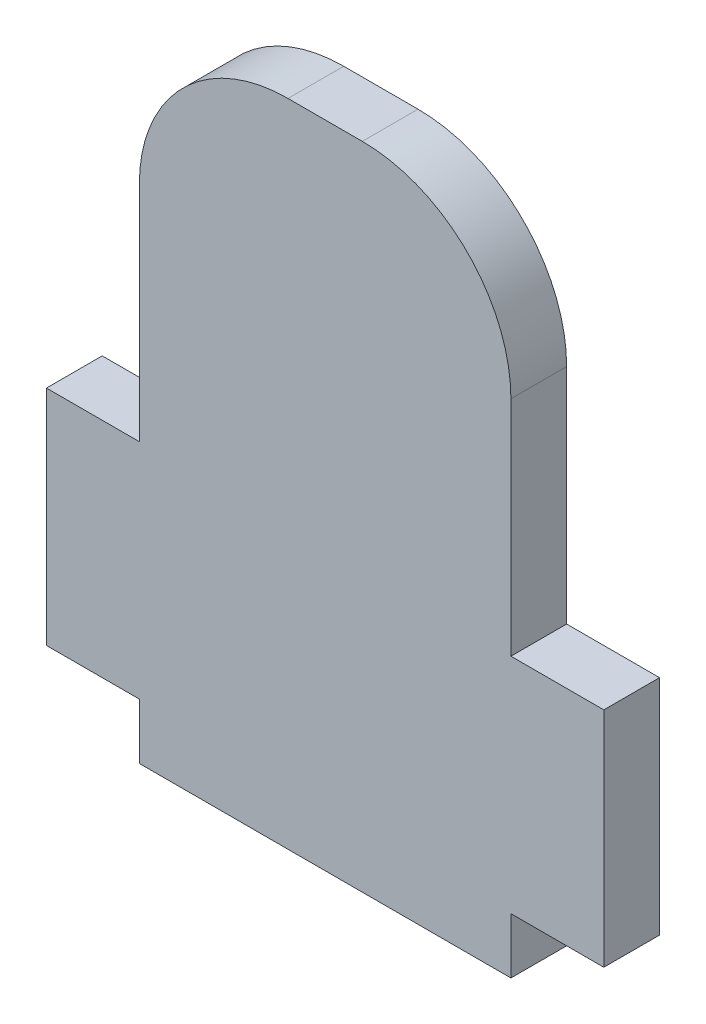
ISO-10303-21;
HEADER;
FILE_DESCRIPTION(('STEP AP214'),'2;1');
FILE_NAME('part.step','',(''),(''),'','','');
FILE_SCHEMA(('AUTOMOTIVE_DESIGN { 1 0 10303 214 1 1 1 1 }'));
ENDSEC;
DATA;
#1=APPLICATION_CONTEXT('core data for automotive mechanical design processes');
#2=APPLICATION_PROTOCOL_DEFINITION('international standard','automotive_design',2000,#1);
#3=PRODUCT_CONTEXT('',#1,'mechanical');
#4=PRODUCT('Part','Part','',(#3));
#5=PRODUCT_RELATED_PRODUCT_CATEGORY('part','',(#4));
#6=PRODUCT_DEFINITION_FORMATION('','',#4);
#7=PRODUCT_DEFINITION_CONTEXT('part definition',#1,'design');
#8=PRODUCT_DEFINITION('design','',#6,#7);
#9=PRODUCT_DEFINITION_SHAPE('','',#8);
#10=(LENGTH_UNIT() NAMED_UNIT(*) SI_UNIT(.MILLI.,.METRE.));
#11=(NAMED_UNIT(*) PLANE_ANGLE_UNIT() SI_UNIT($,.RADIAN.));
#12=(NAMED_UNIT(*) SI_UNIT($,.STERADIAN.) SOLID_ANGLE_UNIT());
#13=UNCERTAINTY_MEASURE_WITH_UNIT(LENGTH_MEASURE(1.E-05),#10,'distance_accuracy_value','');
#14=(GEOMETRIC_REPRESENTATION_CONTEXT(3) GLOBAL_UNCERTAINTY_ASSIGNED_CONTEXT((#13)) GLOBAL_UNIT_ASSIGNED_CONTEXT((#10,
#11,#12)) REPRESENTATION_CONTEXT('',''));
#15=CARTESIAN_POINT('',(0.,0.,0.));
#16=DIRECTION('',(0.,0.,1.));
#17=DIRECTION('',(1.,0.,0.));
#18=AXIS2_PLACEMENT_3D('',#15,#16,#17);
#19=CARTESIAN_POINT('',(-10.,-17.5,3.));
#20=DIRECTION('',(1.,0.,0.));
#21=DIRECTION('',(0.,0.,-1.));
#22=AXIS2_PLACEMENT_3D('',#19,#20,#21);
#23=PLANE('',#22);
#24=DIRECTION('',(0.,-1.,0.));
#25=VECTOR('',#24,1.);
#26=CARTESIAN_POINT('',(-10.,-17.5,0.));
#27=LINE('',#26,#25);
#28=CARTESIAN_POINT('',(-10.,-14.5,0.));
#29=VERTEX_POINT('',#28);
#30=CARTESIAN_POINT('',(-10.,-17.5,0.));
#31=VERTEX_POINT('',#30);
#32=EDGE_CURVE('E178',#29,#31,#27,.T.);
#33=ORIENTED_EDGE('',*,*,#32,.T.);
#34=DIRECTION('',(0.,0.,-1.));
#35=VECTOR('',#34,1.);
#36=CARTESIAN_POINT('',(-10.,-17.5,3.));
#37=LINE('',#36,#35);
#38=CARTESIAN_POINT('',(-10.,-17.5,3.));
#39=VERTEX_POINT('',#38);
#40=EDGE_CURVE('E11',#39,#31,#37,.T.);
#41=ORIENTED_EDGE('',*,*,#40,.F.);
#42=DIRECTION('',(0.,-1.,0.));
#43=VECTOR('',#42,1.);
#44=CARTESIAN_POINT('',(-10.,-17.5,3.));
#45=LINE('',#44,#43);
#46=CARTESIAN_POINT('',(-10.,-14.5,3.));
#47=VERTEX_POINT('',#46);
#48=EDGE_CURVE('E218',#47,#39,#45,.T.);
#49=ORIENTED_EDGE('',*,*,#48,.F.);
#50=DIRECTION('',(0.,0.,-1.));
#51=VECTOR('',#50,1.);
#52=CARTESIAN_POINT('',(-10.,-14.5,3.));
#53=LINE('',#52,#51);
#54=EDGE_CURVE('E174',#47,#29,#53,.T.);
#55=ORIENTED_EDGE('',*,*,#54,.T.);
#56=EDGE_LOOP('',(#33,#41,#49,#55));
#57=FACE_BOUND('',#56,.T.);
#58=ADVANCED_FACE('F41',(#57),#23,.F.);
#59=CARTESIAN_POINT('',(-10.,-17.5,3.));
#60=DIRECTION('',(0.,1.,0.));
#61=DIRECTION('',(0.,0.,1.));
#62=AXIS2_PLACEMENT_3D('',#59,#60,#61);
#63=PLANE('',#62);
#64=DIRECTION('',(1.,0.,0.));
#65=VECTOR('',#64,1.);
#66=CARTESIAN_POINT('',(-10.,-17.5,0.));
#67=LINE('',#66,#65);
#68=CARTESIAN_POINT('',(10.,-17.5,0.));
#69=VERTEX_POINT('',#68);
#70=EDGE_CURVE('E182',#31,#69,#67,.T.);
#71=ORIENTED_EDGE('',*,*,#70,.T.);
#72=DIRECTION('',(0.,0.,-1.));
#73=VECTOR('',#72,1.);
#74=CARTESIAN_POINT('',(10.,-17.5,3.));
#75=LINE('',#74,#73);
#76=CARTESIAN_POINT('',(10.,-17.5,3.));
#77=VERTEX_POINT('',#76);
#78=EDGE_CURVE('E50',#77,#69,#75,.T.);
#79=ORIENTED_EDGE('',*,*,#78,.F.);
#80=DIRECTION('',(1.,0.,0.));
#81=VECTOR('',#80,1.);
#82=CARTESIAN_POINT('',(-10.,-17.5,3.));
#83=LINE('',#82,#81);
#84=EDGE_CURVE('E119',#39,#77,#83,.T.);
#85=ORIENTED_EDGE('',*,*,#84,.F.);
#86=ORIENTED_EDGE('',*,*,#40,.T.);
#87=EDGE_LOOP('',(#71,#79,#85,#86));
#88=FACE_BOUND('',#87,.T.);
#89=ADVANCED_FACE('F326',(#88),#63,.F.);
#90=CARTESIAN_POINT('',(10.,-17.5,3.));
#91=DIRECTION('',(-1.,0.,0.));
#92=DIRECTION('',(0.,0.,1.));
#93=AXIS2_PLACEMENT_3D('',#90,#91,#92);
#94=PLANE('',#93);
#95=DIRECTION('',(0.,1.,0.));
#96=VECTOR('',#95,1.);
#97=CARTESIAN_POINT('',(10.,-17.5,0.));
#98=LINE('',#97,#96);
#99=CARTESIAN_POINT('',(10.,-14.5,0.));
#100=VERTEX_POINT('',#99);
#101=EDGE_CURVE('E185',#69,#100,#98,.T.);
#102=ORIENTED_EDGE('',*,*,#101,.T.);
#103=DIRECTION('',(0.,0.,-1.));
#104=VECTOR('',#103,1.);
#105=CARTESIAN_POINT('',(10.,-14.5,3.));
#106=LINE('',#105,#104);
#107=CARTESIAN_POINT('',(10.,-14.5,3.));
#108=VERTEX_POINT('',#107);
#109=EDGE_CURVE('E253',#108,#100,#106,.T.);
#110=ORIENTED_EDGE('',*,*,#109,.F.);
#111=DIRECTION('',(0.,1.,0.));
#112=VECTOR('',#111,1.);
#113=CARTESIAN_POINT('',(10.,-17.5,3.));
#114=LINE('',#113,#112);
#115=EDGE_CURVE('E263',#77,#108,#114,.T.);
#116=ORIENTED_EDGE('',*,*,#115,.F.);
#117=ORIENTED_EDGE('',*,*,#78,.T.);
#118=EDGE_LOOP('',(#102,#110,#116,#117));
#119=FACE_BOUND('',#118,.T.);
#120=ADVANCED_FACE('F261',(#119),#94,.F.);
#121=CARTESIAN_POINT('',(10.,-14.5,3.));
#122=DIRECTION('',(0.,1.,0.));
#123=DIRECTION('',(-1.,0.,0.));
#124=AXIS2_PLACEMENT_3D('',#121,#122,#123);
#125=PLANE('',#124);
#126=DIRECTION('',(1.,0.,0.));
#127=VECTOR('',#126,1.);
#128=CARTESIAN_POINT('',(10.,-14.5,0.));
#129=LINE('',#128,#127);
#130=CARTESIAN_POINT('',(15.,-14.5,0.));
#131=VERTEX_POINT('',#130);
#132=EDGE_CURVE('E188',#100,#131,#129,.T.);
#133=ORIENTED_EDGE('',*,*,#132,.T.);
#134=DIRECTION('',(0.,0.,-1.));
#135=VECTOR('',#134,1.);
#136=CARTESIAN_POINT('',(15.,-14.5,3.));
#137=LINE('',#136,#135);
#138=CARTESIAN_POINT('',(15.,-14.5,3.));
#139=VERTEX_POINT('',#138);
#140=EDGE_CURVE('E249',#139,#131,#137,.T.);
#141=ORIENTED_EDGE('',*,*,#140,.F.);
#142=DIRECTION('',(1.,0.,0.));
#143=VECTOR('',#142,1.);
#144=CARTESIAN_POINT('',(10.,-14.5,3.));
#145=LINE('',#144,#143);
#146=EDGE_CURVE('E282',#108,#139,#145,.T.);
#147=ORIENTED_EDGE('',*,*,#146,.F.);
#148=ORIENTED_EDGE('',*,*,#109,.T.);
#149=EDGE_LOOP('',(#133,#141,#147,#148));
#150=FACE_BOUND('',#149,.T.);
#151=ADVANCED_FACE('F272',(#150),#125,.F.);
#152=CARTESIAN_POINT('',(15.,-14.5,3.));
#153=DIRECTION('',(-1.,0.,0.));
#154=DIRECTION('',(0.,0.,1.));
#155=AXIS2_PLACEMENT_3D('',#152,#153,#154);
#156=PLANE('',#155);
#157=DIRECTION('',(0.,1.,0.));
#158=VECTOR('',#157,1.);
#159=CARTESIAN_POINT('',(15.,-14.5,0.));
#160=LINE('',#159,#158);
#161=CARTESIAN_POINT('',(15.,-2.5,0.));
#162=VERTEX_POINT('',#161);
#163=EDGE_CURVE('E191',#131,#162,#160,.T.);
#164=ORIENTED_EDGE('',*,*,#163,.T.);
#165=DIRECTION('',(0.,0.,-1.));
#166=VECTOR('',#165,1.);
#167=CARTESIAN_POINT('',(15.,-2.5,3.));
#168=LINE('',#167,#166);
#169=CARTESIAN_POINT('',(15.,-2.5,3.));
#170=VERTEX_POINT('',#169);
#171=EDGE_CURVE('E245',#170,#162,#168,.T.);
#172=ORIENTED_EDGE('',*,*,#171,.F.);
#173=DIRECTION('',(0.,1.,0.));
#174=VECTOR('',#173,1.);
#175=CARTESIAN_POINT('',(15.,-14.5,3.));
#176=LINE('',#175,#174);
#177=EDGE_CURVE('E278',#139,#170,#176,.T.);
#178=ORIENTED_EDGE('',*,*,#177,.F.);
#179=ORIENTED_EDGE('',*,*,#140,.T.);
#180=EDGE_LOOP('',(#164,#172,#178,#179));
#181=FACE_BOUND('',#180,.T.);
#182=ADVANCED_FACE('F276',(#181),#156,.F.);
#183=CARTESIAN_POINT('',(10.,-2.5,3.));
#184=DIRECTION('',(0.,-1.,0.));
#185=DIRECTION('',(1.,0.,0.));
#186=AXIS2_PLACEMENT_3D('',#183,#184,#185);
#187=PLANE('',#186);
#188=DIRECTION('',(-1.,0.,0.));
#189=VECTOR('',#188,1.);
#190=CARTESIAN_POINT('',(10.,-2.5,0.));
#191=LINE('',#190,#189);
#192=CARTESIAN_POINT('',(10.,-2.5,0.));
#193=VERTEX_POINT('',#192);
#194=EDGE_CURVE('E194',#162,#193,#191,.T.);
#195=ORIENTED_EDGE('',*,*,#194,.T.);
#196=DIRECTION('',(0.,0.,-1.));
#197=VECTOR('',#196,1.);
#198=CARTESIAN_POINT('',(10.,-2.5,3.));
#199=LINE('',#198,#197);
#200=CARTESIAN_POINT('',(10.,-2.5,3.));
#201=VERTEX_POINT('',#200);
#202=EDGE_CURVE('E241',#201,#193,#199,.T.);
#203=ORIENTED_EDGE('',*,*,#202,.F.);
#204=DIRECTION('',(-1.,0.,0.));
#205=VECTOR('',#204,1.);
#206=CARTESIAN_POINT('',(10.,-2.5,3.));
#207=LINE('',#206,#205);
#208=EDGE_CURVE('E281',#170,#201,#207,.T.);
#209=ORIENTED_EDGE('',*,*,#208,.F.);
#210=ORIENTED_EDGE('',*,*,#171,.T.);
#211=EDGE_LOOP('',(#195,#203,#209,#210));
#212=FACE_BOUND('',#211,.T.);
#213=ADVANCED_FACE('F339',(#212),#187,.F.);
#214=CARTESIAN_POINT('',(10.,-2.5,3.));
#215=DIRECTION('',(-1.,0.,0.));
#216=DIRECTION('',(0.,0.,1.));
#217=AXIS2_PLACEMENT_3D('',#214,#215,#216);
#218=PLANE('',#217);
#219=DIRECTION('',(0.,1.,0.));
#220=VECTOR('',#219,1.);
#221=CARTESIAN_POINT('',(10.,-2.5,0.));
#222=LINE('',#221,#220);
#223=CARTESIAN_POINT('',(10.,9.5,0.));
#224=VERTEX_POINT('',#223);
#225=EDGE_CURVE('E197',#193,#224,#222,.T.);
#226=ORIENTED_EDGE('',*,*,#225,.T.);
#227=DIRECTION('',(0.,0.,-1.));
#228=VECTOR('',#227,1.);
#229=CARTESIAN_POINT('',(10.,9.5,3.));
#230=LINE('',#229,#228);
#231=CARTESIAN_POINT('',(10.,9.5,3.));
#232=VERTEX_POINT('',#231);
#233=EDGE_CURVE('E237',#232,#224,#230,.T.);
#234=ORIENTED_EDGE('',*,*,#233,.F.);
#235=DIRECTION('',(0.,1.,0.));
#236=VECTOR('',#235,1.);
#237=CARTESIAN_POINT('',(10.,-2.5,3.));
#238=LINE('',#237,#236);
#239=EDGE_CURVE('E286',#201,#232,#238,.T.);
#240=ORIENTED_EDGE('',*,*,#239,.F.);
#241=ORIENTED_EDGE('',*,*,#202,.T.);
#242=EDGE_LOOP('',(#226,#234,#240,#241));
#243=FACE_BOUND('',#242,.T.);
#244=ADVANCED_FACE('F342',(#243),#218,.F.);
#245=CARTESIAN_POINT('',(2.,9.5,3.));
#246=DIRECTION('',(0.,0.,-1.));
#247=DIRECTION('',(-1.,0.,0.));
#248=AXIS2_PLACEMENT_3D('',#245,#246,#247);
#249=CYLINDRICAL_SURFACE('',#248,8.);
#250=CARTESIAN_POINT('',(2.,9.5,0.));
#251=DIRECTION('',(0.,0.,1.));
#252=DIRECTION('',(-1.,0.,0.));
#253=AXIS2_PLACEMENT_3D('',#250,#251,#252);
#254=CIRCLE('',#253,8.);
#255=CARTESIAN_POINT('',(2.,17.5,0.));
#256=VERTEX_POINT('',#255);
#257=EDGE_CURVE('E200',#224,#256,#254,.T.);
#258=ORIENTED_EDGE('',*,*,#257,.T.);
#259=DIRECTION('',(0.,0.,-1.));
#260=VECTOR('',#259,1.);
#261=CARTESIAN_POINT('',(2.,17.5,3.));
#262=LINE('',#261,#260);
#263=CARTESIAN_POINT('',(2.,17.5,3.));
#264=VERTEX_POINT('',#263);
#265=EDGE_CURVE('E233',#264,#256,#262,.T.);
#266=ORIENTED_EDGE('',*,*,#265,.F.);
#267=CARTESIAN_POINT('',(2.,9.5,3.));
#268=DIRECTION('',(0.,0.,1.));
#269=DIRECTION('',(-1.,0.,0.));
#270=AXIS2_PLACEMENT_3D('',#267,#268,#269);
#271=CIRCLE('',#270,8.);
#272=EDGE_CURVE('E293',#232,#264,#271,.T.);
#273=ORIENTED_EDGE('',*,*,#272,.F.);
#274=ORIENTED_EDGE('',*,*,#233,.T.);
#275=EDGE_LOOP('',(#258,#266,#273,#274));
#276=FACE_BOUND('',#275,.T.);
#277=ADVANCED_FACE('F346',(#276),#249,.T.);
#278=CARTESIAN_POINT('',(-2.,17.5,3.));
#279=DIRECTION('',(0.,-1.,0.));
#280=DIRECTION('',(0.,0.,-1.));
#281=AXIS2_PLACEMENT_3D('',#278,#279,#280);
#282=PLANE('',#281);
#283=DIRECTION('',(-1.,0.,0.));
#284=VECTOR('',#283,1.);
#285=CARTESIAN_POINT('',(-2.,17.5,0.));
#286=LINE('',#285,#284);
#287=CARTESIAN_POINT('',(-2.,17.5,0.));
#288=VERTEX_POINT('',#287);
#289=EDGE_CURVE('E203',#256,#288,#286,.T.);
#290=ORIENTED_EDGE('',*,*,#289,.T.);
#291=DIRECTION('',(0.,0.,-1.));
#292=VECTOR('',#291,1.);
#293=CARTESIAN_POINT('',(-2.,17.5,3.));
#294=LINE('',#293,#292);
#295=CARTESIAN_POINT('',(-2.,17.5,3.));
#296=VERTEX_POINT('',#295);
#297=EDGE_CURVE('E229',#296,#288,#294,.T.);
#298=ORIENTED_EDGE('',*,*,#297,.F.);
#299=DIRECTION('',(-1.,0.,0.));
#300=VECTOR('',#299,1.);
#301=CARTESIAN_POINT('',(-2.,17.5,3.));
#302=LINE('',#301,#300);
#303=EDGE_CURVE('E296',#264,#296,#302,.T.);
#304=ORIENTED_EDGE('',*,*,#303,.F.);
#305=ORIENTED_EDGE('',*,*,#265,.T.);
#306=EDGE_LOOP('',(#290,#298,#304,#305));
#307=FACE_BOUND('',#306,.T.);
#308=ADVANCED_FACE('F350',(#307),#282,.F.);
#309=CARTESIAN_POINT('',(-2.,9.5,3.));
#310=DIRECTION('',(0.,0.,-1.));
#311=DIRECTION('',(-1.,0.,0.));
#312=AXIS2_PLACEMENT_3D('',#309,#310,#311);
#313=CYLINDRICAL_SURFACE('',#312,8.);
#314=CARTESIAN_POINT('',(-2.,9.5,0.));
#315=DIRECTION('',(0.,0.,1.));
#316=DIRECTION('',(-1.,0.,0.));
#317=AXIS2_PLACEMENT_3D('',#314,#315,#316);
#318=CIRCLE('',#317,8.);
#319=CARTESIAN_POINT('',(-10.,9.5,0.));
#320=VERTEX_POINT('',#319);
#321=EDGE_CURVE('E206',#288,#320,#318,.T.);
#322=ORIENTED_EDGE('',*,*,#321,.T.);
#323=DIRECTION('',(0.,0.,-1.));
#324=VECTOR('',#323,1.);
#325=CARTESIAN_POINT('',(-10.,9.5,3.));
#326=LINE('',#325,#324);
#327=CARTESIAN_POINT('',(-10.,9.5,3.));
#328=VERTEX_POINT('',#327);
#329=EDGE_CURVE('E225',#328,#320,#326,.T.);
#330=ORIENTED_EDGE('',*,*,#329,.F.);
#331=CARTESIAN_POINT('',(-2.,9.5,3.));
#332=DIRECTION('',(0.,0.,1.));
#333=DIRECTION('',(-1.,0.,0.));
#334=AXIS2_PLACEMENT_3D('',#331,#332,#333);
#335=CIRCLE('',#334,8.);
#336=EDGE_CURVE('E299',#296,#328,#335,.T.);
#337=ORIENTED_EDGE('',*,*,#336,.F.);
#338=ORIENTED_EDGE('',*,*,#297,.T.);
#339=EDGE_LOOP('',(#322,#330,#337,#338));
#340=FACE_BOUND('',#339,.T.);
#341=ADVANCED_FACE('F307',(#340),#313,.T.);
#342=CARTESIAN_POINT('',(-10.,-2.5,3.));
#343=DIRECTION('',(1.,0.,0.));
#344=DIRECTION('',(0.,0.,-1.));
#345=AXIS2_PLACEMENT_3D('',#342,#343,#344);
#346=PLANE('',#345);
#347=DIRECTION('',(0.,-1.,0.));
#348=VECTOR('',#347,1.);
#349=CARTESIAN_POINT('',(-10.,-2.5,0.));
#350=LINE('',#349,#348);
#351=CARTESIAN_POINT('',(-10.,-2.5,0.));
#352=VERTEX_POINT('',#351);
#353=EDGE_CURVE('E209',#320,#352,#350,.T.);
#354=ORIENTED_EDGE('',*,*,#353,.T.);
#355=DIRECTION('',(0.,0.,-1.));
#356=VECTOR('',#355,1.);
#357=CARTESIAN_POINT('',(-10.,-2.5,3.));
#358=LINE('',#357,#356);
#359=CARTESIAN_POINT('',(-10.,-2.5,3.));
#360=VERTEX_POINT('',#359);
#361=EDGE_CURVE('E167',#360,#352,#358,.T.);
#362=ORIENTED_EDGE('',*,*,#361,.F.);
#363=DIRECTION('',(0.,-1.,0.));
#364=VECTOR('',#363,1.);
#365=CARTESIAN_POINT('',(-10.,-2.5,3.));
#366=LINE('',#365,#364);
#367=EDGE_CURVE('E156',#328,#360,#366,.T.);
#368=ORIENTED_EDGE('',*,*,#367,.F.);
#369=ORIENTED_EDGE('',*,*,#329,.T.);
#370=EDGE_LOOP('',(#354,#362,#368,#369));
#371=FACE_BOUND('',#370,.T.);
#372=ADVANCED_FACE('F311',(#371),#346,.F.);
#373=CARTESIAN_POINT('',(-15.,-2.5,3.));
#374=DIRECTION('',(0.,-1.,0.));
#375=DIRECTION('',(0.,0.,-1.));
#376=AXIS2_PLACEMENT_3D('',#373,#374,#375);
#377=PLANE('',#376);
#378=DIRECTION('',(-1.,0.,0.));
#379=VECTOR('',#378,1.);
#380=CARTESIAN_POINT('',(-15.,-2.5,0.));
#381=LINE('',#380,#379);
#382=CARTESIAN_POINT('',(-15.,-2.5,0.));
#383=VERTEX_POINT('',#382);
#384=EDGE_CURVE('E165',#352,#383,#381,.T.);
#385=ORIENTED_EDGE('',*,*,#384,.T.);
#386=DIRECTION('',(0.,0.,-1.));
#387=VECTOR('',#386,1.);
#388=CARTESIAN_POINT('',(-15.,-2.5,3.));
#389=LINE('',#388,#387);
#390=CARTESIAN_POINT('',(-15.,-2.5,3.));
#391=VERTEX_POINT('',#390);
#392=EDGE_CURVE('E162',#391,#383,#389,.T.);
#393=ORIENTED_EDGE('',*,*,#392,.F.);
#394=DIRECTION('',(-1.,0.,0.));
#395=VECTOR('',#394,1.);
#396=CARTESIAN_POINT('',(-15.,-2.5,3.));
#397=LINE('',#396,#395);
#398=EDGE_CURVE('E150',#360,#391,#397,.T.);
#399=ORIENTED_EDGE('',*,*,#398,.F.);
#400=ORIENTED_EDGE('',*,*,#361,.T.);
#401=EDGE_LOOP('',(#385,#393,#399,#400));
#402=FACE_BOUND('',#401,.T.);
#403=ADVANCED_FACE('F163',(#402),#377,.F.);
#404=CARTESIAN_POINT('',(-15.,-14.5,3.));
#405=DIRECTION('',(1.,0.,0.));
#406=DIRECTION('',(0.,0.,-1.));
#407=AXIS2_PLACEMENT_3D('',#404,#405,#406);
#408=PLANE('',#407);
#409=DIRECTION('',(0.,-1.,0.));
#410=VECTOR('',#409,1.);
#411=CARTESIAN_POINT('',(-15.,-14.5,0.));
#412=LINE('',#411,#410);
#413=CARTESIAN_POINT('',(-15.,-14.5,0.));
#414=VERTEX_POINT('',#413);
#415=EDGE_CURVE('E105',#383,#414,#412,.T.);
#416=ORIENTED_EDGE('',*,*,#415,.T.);
#417=DIRECTION('',(0.,0.,-1.));
#418=VECTOR('',#417,1.);
#419=CARTESIAN_POINT('',(-15.,-14.5,3.));
#420=LINE('',#419,#418);
#421=CARTESIAN_POINT('',(-15.,-14.5,3.));
#422=VERTEX_POINT('',#421);
#423=EDGE_CURVE('E168',#422,#414,#420,.T.);
#424=ORIENTED_EDGE('',*,*,#423,.F.);
#425=DIRECTION('',(0.,-1.,0.));
#426=VECTOR('',#425,1.);
#427=CARTESIAN_POINT('',(-15.,-14.5,3.));
#428=LINE('',#427,#426);
#429=EDGE_CURVE('E154',#391,#422,#428,.T.);
#430=ORIENTED_EDGE('',*,*,#429,.F.);
#431=ORIENTED_EDGE('',*,*,#392,.T.);
#432=EDGE_LOOP('',(#416,#424,#430,#431));
#433=FACE_BOUND('',#432,.T.);
#434=ADVANCED_FACE('F170',(#433),#408,.F.);
#435=CARTESIAN_POINT('',(-15.,-14.5,3.));
#436=DIRECTION('',(0.,1.,0.));
#437=DIRECTION('',(0.,0.,1.));
#438=AXIS2_PLACEMENT_3D('',#435,#436,#437);
#439=PLANE('',#438);
#440=DIRECTION('',(1.,0.,0.));
#441=VECTOR('',#440,1.);
#442=CARTESIAN_POINT('',(-15.,-14.5,0.));
#443=LINE('',#442,#441);
#444=EDGE_CURVE('E111',#414,#29,#443,.T.);
#445=ORIENTED_EDGE('',*,*,#444,.T.);
#446=ORIENTED_EDGE('',*,*,#54,.F.);
#447=DIRECTION('',(1.,0.,0.));
#448=VECTOR('',#447,1.);
#449=CARTESIAN_POINT('',(-15.,-14.5,3.));
#450=LINE('',#449,#448);
#451=EDGE_CURVE('E58',#422,#47,#450,.T.);
#452=ORIENTED_EDGE('',*,*,#451,.F.);
#453=ORIENTED_EDGE('',*,*,#423,.T.);
#454=EDGE_LOOP('',(#445,#446,#452,#453));
#455=FACE_BOUND('',#454,.T.);
#456=ADVANCED_FACE('F315',(#455),#439,.F.);
#457=CARTESIAN_POINT('',(-2.,9.5,3.));
#458=DIRECTION('',(0.,0.,-1.));
#459=DIRECTION('',(-1.,0.,0.));
#460=AXIS2_PLACEMENT_3D('',#457,#458,#459);
#461=PLANE('',#460);
#462=ORIENTED_EDGE('',*,*,#48,.T.);
#463=ORIENTED_EDGE('',*,*,#84,.T.);
#464=ORIENTED_EDGE('',*,*,#115,.T.);
#465=ORIENTED_EDGE('',*,*,#146,.T.);
#466=ORIENTED_EDGE('',*,*,#177,.T.);
#467=ORIENTED_EDGE('',*,*,#208,.T.);
#468=ORIENTED_EDGE('',*,*,#239,.T.);
#469=ORIENTED_EDGE('',*,*,#272,.T.);
#470=ORIENTED_EDGE('',*,*,#303,.T.);
#471=ORIENTED_EDGE('',*,*,#336,.T.);
#472=ORIENTED_EDGE('',*,*,#367,.T.);
#473=ORIENTED_EDGE('',*,*,#398,.T.);
#474=ORIENTED_EDGE('',*,*,#429,.T.);
#475=ORIENTED_EDGE('',*,*,#451,.T.);
#476=EDGE_LOOP('',(#462,#463,#464,#465,#466,#467,#468,#469,#470,#471,#472,#473,#474,#475));
#477=FACE_BOUND('',#476,.T.);
#478=ADVANCED_FACE('F152',(#477),#461,.F.);
#479=CARTESIAN_POINT('',(-2.,9.5,0.));
#480=DIRECTION('',(0.,0.,-1.));
#481=DIRECTION('',(-1.,0.,0.));
#482=AXIS2_PLACEMENT_3D('',#479,#480,#481);
#483=PLANE('',#482);
#484=ORIENTED_EDGE('',*,*,#32,.F.);
#485=ORIENTED_EDGE('',*,*,#444,.F.);
#486=ORIENTED_EDGE('',*,*,#415,.F.);
#487=ORIENTED_EDGE('',*,*,#384,.F.);
#488=ORIENTED_EDGE('',*,*,#353,.F.);
#489=ORIENTED_EDGE('',*,*,#321,.F.);
#490=ORIENTED_EDGE('',*,*,#289,.F.);
#491=ORIENTED_EDGE('',*,*,#257,.F.);
#492=ORIENTED_EDGE('',*,*,#225,.F.);
#493=ORIENTED_EDGE('',*,*,#194,.F.);
#494=ORIENTED_EDGE('',*,*,#163,.F.);
#495=ORIENTED_EDGE('',*,*,#132,.F.);
#496=ORIENTED_EDGE('',*,*,#101,.F.);
#497=ORIENTED_EDGE('',*,*,#70,.F.);
#498=EDGE_LOOP('',(#484,#485,#486,#487,#488,#489,#490,#491,#492,#493,#494,#495,#496,#497));
#499=FACE_BOUND('',#498,.T.);
#500=ADVANCED_FACE('F267',(#499),#483,.T.);
#501=CLOSED_SHELL('',(#58,#89,#120,#151,#182,#213,#244,#277,#308,#341,#372,#403,#434,#456,#478,#500));
#502=MANIFOLD_SOLID_BREP('B2',#501);
#503=ADVANCED_BREP_SHAPE_REPRESENTATION('',(#18,#502),#14);
#504=SHAPE_DEFINITION_REPRESENTATION(#9,#503);
ENDSEC;
END-ISO-10303-21;
